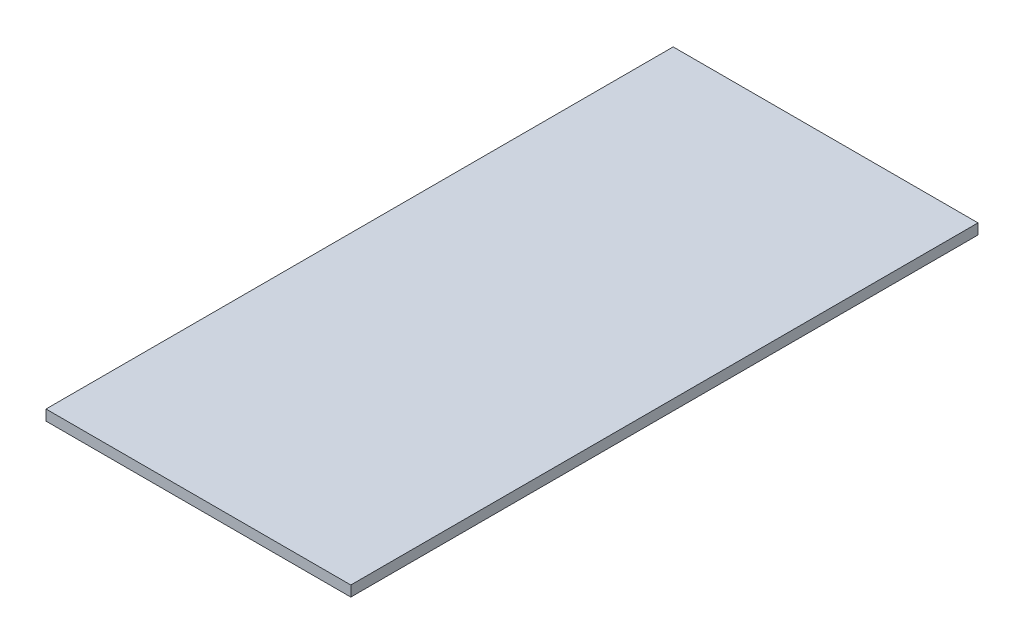
ISO-10303-21;
HEADER;
FILE_DESCRIPTION(('STEP AP214'),'2;1');
FILE_NAME('part.step','',(''),(''),'','','');
FILE_SCHEMA(('AUTOMOTIVE_DESIGN { 1 0 10303 214 1 1 1 1 }'));
ENDSEC;
DATA;
#1=APPLICATION_CONTEXT('core data for automotive mechanical design processes');
#2=APPLICATION_PROTOCOL_DEFINITION('international standard','automotive_design',2000,#1);
#3=PRODUCT_CONTEXT('',#1,'mechanical');
#4=PRODUCT('Part','Part','',(#3));
#5=PRODUCT_RELATED_PRODUCT_CATEGORY('part','',(#4));
#6=PRODUCT_DEFINITION_FORMATION('','',#4);
#7=PRODUCT_DEFINITION_CONTEXT('part definition',#1,'design');
#8=PRODUCT_DEFINITION('design','',#6,#7);
#9=PRODUCT_DEFINITION_SHAPE('','',#8);
#10=(LENGTH_UNIT() NAMED_UNIT(*) SI_UNIT(.MILLI.,.METRE.));
#11=(NAMED_UNIT(*) PLANE_ANGLE_UNIT() SI_UNIT($,.RADIAN.));
#12=(NAMED_UNIT(*) SI_UNIT($,.STERADIAN.) SOLID_ANGLE_UNIT());
#13=UNCERTAINTY_MEASURE_WITH_UNIT(LENGTH_MEASURE(1.E-05),#10,'distance_accuracy_value','');
#14=(GEOMETRIC_REPRESENTATION_CONTEXT(3) GLOBAL_UNCERTAINTY_ASSIGNED_CONTEXT((#13)) GLOBAL_UNIT_ASSIGNED_CONTEXT((#10,
#11,#12)) REPRESENTATION_CONTEXT('',''));
#15=CARTESIAN_POINT('',(0.,0.,0.));
#16=DIRECTION('',(0.,0.,1.));
#17=DIRECTION('',(1.,0.,0.));
#18=AXIS2_PLACEMENT_3D('',#15,#16,#17);
#19=CARTESIAN_POINT('',(276.225,19.05,568.36945));
#20=DIRECTION('',(-1.,0.,0.));
#21=DIRECTION('',(0.,0.,1.));
#22=AXIS2_PLACEMENT_3D('',#19,#20,#21);
#23=PLANE('',#22);
#24=DIRECTION('',(0.,0.,-1.));
#25=VECTOR('',#24,1.);
#26=CARTESIAN_POINT('',(276.225,0.,568.36945));
#27=LINE('',#26,#25);
#28=CARTESIAN_POINT('',(276.225,0.,568.36945));
#29=VERTEX_POINT('',#28);
#30=CARTESIAN_POINT('',(276.225,0.,-568.36945));
#31=VERTEX_POINT('',#30);
#32=EDGE_CURVE('E96',#29,#31,#27,.T.);
#33=ORIENTED_EDGE('',*,*,#32,.T.);
#34=DIRECTION('',(0.,-1.,0.));
#35=VECTOR('',#34,1.);
#36=CARTESIAN_POINT('',(276.225,19.05,-568.36945));
#37=LINE('',#36,#35);
#38=CARTESIAN_POINT('',(276.225,19.05,-568.36945));
#39=VERTEX_POINT('',#38);
#40=EDGE_CURVE('E11',#39,#31,#37,.T.);
#41=ORIENTED_EDGE('',*,*,#40,.F.);
#42=DIRECTION('',(0.,0.,-1.));
#43=VECTOR('',#42,1.);
#44=CARTESIAN_POINT('',(276.225,19.05,568.36945));
#45=LINE('',#44,#43);
#46=CARTESIAN_POINT('',(276.225,19.05,568.36945));
#47=VERTEX_POINT('',#46);
#48=EDGE_CURVE('E84',#47,#39,#45,.T.);
#49=ORIENTED_EDGE('',*,*,#48,.F.);
#50=DIRECTION('',(0.,-1.,0.));
#51=VECTOR('',#50,1.);
#52=CARTESIAN_POINT('',(276.225,19.05,568.36945));
#53=LINE('',#52,#51);
#54=EDGE_CURVE('E92',#47,#29,#53,.T.);
#55=ORIENTED_EDGE('',*,*,#54,.T.);
#56=EDGE_LOOP('',(#33,#41,#49,#55));
#57=FACE_BOUND('',#56,.T.);
#58=ADVANCED_FACE('F33',(#57),#23,.F.);
#59=CARTESIAN_POINT('',(-276.225,19.05,-568.36945));
#60=DIRECTION('',(0.,0.,1.));
#61=DIRECTION('',(1.,0.,0.));
#62=AXIS2_PLACEMENT_3D('',#59,#60,#61);
#63=PLANE('',#62);
#64=DIRECTION('',(-1.,0.,0.));
#65=VECTOR('',#64,1.);
#66=CARTESIAN_POINT('',(-276.225,0.,-568.36945));
#67=LINE('',#66,#65);
#68=CARTESIAN_POINT('',(-276.225,0.,-568.36945));
#69=VERTEX_POINT('',#68);
#70=EDGE_CURVE('E88',#31,#69,#67,.T.);
#71=ORIENTED_EDGE('',*,*,#70,.T.);
#72=DIRECTION('',(0.,-1.,0.));
#73=VECTOR('',#72,1.);
#74=CARTESIAN_POINT('',(-276.225,19.05,-568.36945));
#75=LINE('',#74,#73);
#76=CARTESIAN_POINT('',(-276.225,19.05,-568.36945));
#77=VERTEX_POINT('',#76);
#78=EDGE_CURVE('E41',#77,#69,#75,.T.);
#79=ORIENTED_EDGE('',*,*,#78,.F.);
#80=DIRECTION('',(-1.,0.,0.));
#81=VECTOR('',#80,1.);
#82=CARTESIAN_POINT('',(-276.225,19.05,-568.36945));
#83=LINE('',#82,#81);
#84=EDGE_CURVE('E79',#39,#77,#83,.T.);
#85=ORIENTED_EDGE('',*,*,#84,.F.);
#86=ORIENTED_EDGE('',*,*,#40,.T.);
#87=EDGE_LOOP('',(#71,#79,#85,#86));
#88=FACE_BOUND('',#87,.T.);
#89=ADVANCED_FACE('F87',(#88),#63,.F.);
#90=CARTESIAN_POINT('',(-276.225,19.05,568.36945));
#91=DIRECTION('',(1.,0.,0.));
#92=DIRECTION('',(0.,0.,-1.));
#93=AXIS2_PLACEMENT_3D('',#90,#91,#92);
#94=PLANE('',#93);
#95=DIRECTION('',(0.,0.,1.));
#96=VECTOR('',#95,1.);
#97=CARTESIAN_POINT('',(-276.225,0.,568.36945));
#98=LINE('',#97,#96);
#99=CARTESIAN_POINT('',(-276.225,0.,568.36945));
#100=VERTEX_POINT('',#99);
#101=EDGE_CURVE('E66',#69,#100,#98,.T.);
#102=ORIENTED_EDGE('',*,*,#101,.T.);
#103=DIRECTION('',(0.,-1.,0.));
#104=VECTOR('',#103,1.);
#105=CARTESIAN_POINT('',(-276.225,19.05,568.36945));
#106=LINE('',#105,#104);
#107=CARTESIAN_POINT('',(-276.225,19.05,568.36945));
#108=VERTEX_POINT('',#107);
#109=EDGE_CURVE('E89',#108,#100,#106,.T.);
#110=ORIENTED_EDGE('',*,*,#109,.F.);
#111=DIRECTION('',(0.,0.,1.));
#112=VECTOR('',#111,1.);
#113=CARTESIAN_POINT('',(-276.225,19.05,568.36945));
#114=LINE('',#113,#112);
#115=EDGE_CURVE('E82',#77,#108,#114,.T.);
#116=ORIENTED_EDGE('',*,*,#115,.F.);
#117=ORIENTED_EDGE('',*,*,#78,.T.);
#118=EDGE_LOOP('',(#102,#110,#116,#117));
#119=FACE_BOUND('',#118,.T.);
#120=ADVANCED_FACE('F90',(#119),#94,.F.);
#121=CARTESIAN_POINT('',(-276.225,19.05,568.36945));
#122=DIRECTION('',(0.,0.,-1.));
#123=DIRECTION('',(-1.,0.,0.));
#124=AXIS2_PLACEMENT_3D('',#121,#122,#123);
#125=PLANE('',#124);
#126=DIRECTION('',(1.,0.,0.));
#127=VECTOR('',#126,1.);
#128=CARTESIAN_POINT('',(-276.225,0.,568.36945));
#129=LINE('',#128,#127);
#130=EDGE_CURVE('E72',#100,#29,#129,.T.);
#131=ORIENTED_EDGE('',*,*,#130,.T.);
#132=ORIENTED_EDGE('',*,*,#54,.F.);
#133=DIRECTION('',(1.,0.,0.));
#134=VECTOR('',#133,1.);
#135=CARTESIAN_POINT('',(-276.225,19.05,568.36945));
#136=LINE('',#135,#134);
#137=EDGE_CURVE('E49',#108,#47,#136,.T.);
#138=ORIENTED_EDGE('',*,*,#137,.F.);
#139=ORIENTED_EDGE('',*,*,#109,.T.);
#140=EDGE_LOOP('',(#131,#132,#138,#139));
#141=FACE_BOUND('',#140,.T.);
#142=ADVANCED_FACE('F103',(#141),#125,.F.);
#143=CARTESIAN_POINT('',(0.,19.05,0.));
#144=DIRECTION('',(0.,-1.,0.));
#145=DIRECTION('',(0.,0.,-1.));
#146=AXIS2_PLACEMENT_3D('',#143,#144,#145);
#147=PLANE('',#146);
#148=ORIENTED_EDGE('',*,*,#48,.T.);
#149=ORIENTED_EDGE('',*,*,#84,.T.);
#150=ORIENTED_EDGE('',*,*,#115,.T.);
#151=ORIENTED_EDGE('',*,*,#137,.T.);
#152=EDGE_LOOP('',(#148,#149,#150,#151));
#153=FACE_BOUND('',#152,.T.);
#154=ADVANCED_FACE('F80',(#153),#147,.F.);
#155=CARTESIAN_POINT('',(0.,0.,0.));
#156=DIRECTION('',(0.,-1.,0.));
#157=DIRECTION('',(0.,0.,-1.));
#158=AXIS2_PLACEMENT_3D('',#155,#156,#157);
#159=PLANE('',#158);
#160=ORIENTED_EDGE('',*,*,#32,.F.);
#161=ORIENTED_EDGE('',*,*,#130,.F.);
#162=ORIENTED_EDGE('',*,*,#101,.F.);
#163=ORIENTED_EDGE('',*,*,#70,.F.);
#164=EDGE_LOOP('',(#160,#161,#162,#163));
#165=FACE_BOUND('',#164,.T.);
#166=ADVANCED_FACE('F106',(#165),#159,.T.);
#167=CLOSED_SHELL('',(#58,#89,#120,#142,#154,#166));
#168=MANIFOLD_SOLID_BREP('B2',#167);
#169=ADVANCED_BREP_SHAPE_REPRESENTATION('',(#18,#168),#14);
#170=SHAPE_DEFINITION_REPRESENTATION(#9,#169);
ENDSEC;
END-ISO-10303-21;
